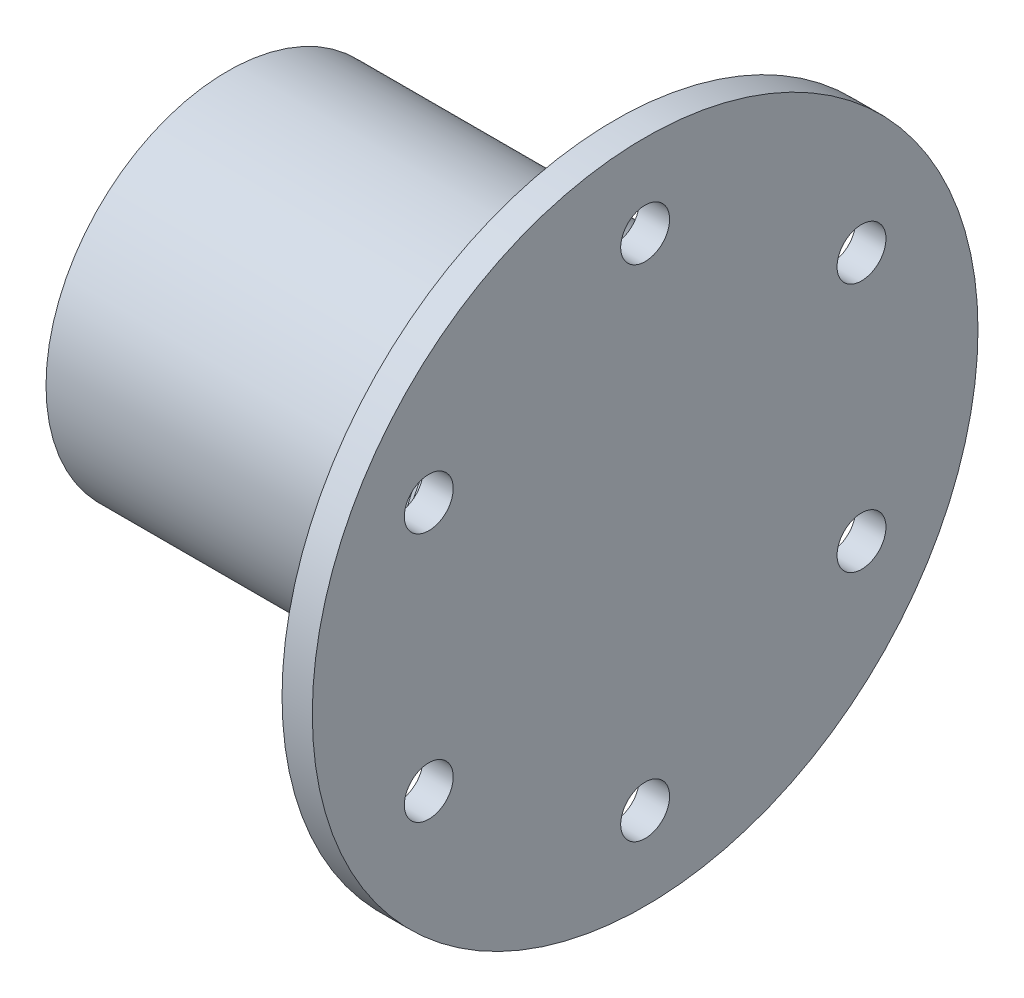
ISO-10303-21;
HEADER;
FILE_DESCRIPTION(('STEP AP214'),'2;1');
FILE_NAME('part.step','',(''),(''),'','','');
FILE_SCHEMA(('AUTOMOTIVE_DESIGN { 1 0 10303 214 1 1 1 1 }'));
ENDSEC;
DATA;
#1=APPLICATION_CONTEXT('core data for automotive mechanical design processes');
#2=APPLICATION_PROTOCOL_DEFINITION('international standard','automotive_design',2000,#1);
#3=PRODUCT_CONTEXT('',#1,'mechanical');
#4=PRODUCT('Part','Part','',(#3));
#5=PRODUCT_RELATED_PRODUCT_CATEGORY('part','',(#4));
#6=PRODUCT_DEFINITION_FORMATION('','',#4);
#7=PRODUCT_DEFINITION_CONTEXT('part definition',#1,'design');
#8=PRODUCT_DEFINITION('design','',#6,#7);
#9=PRODUCT_DEFINITION_SHAPE('','',#8);
#10=(LENGTH_UNIT() NAMED_UNIT(*) SI_UNIT(.MILLI.,.METRE.));
#11=(NAMED_UNIT(*) PLANE_ANGLE_UNIT() SI_UNIT($,.RADIAN.));
#12=(NAMED_UNIT(*) SI_UNIT($,.STERADIAN.) SOLID_ANGLE_UNIT());
#13=UNCERTAINTY_MEASURE_WITH_UNIT(LENGTH_MEASURE(1.E-05),#10,'distance_accuracy_value','');
#14=(GEOMETRIC_REPRESENTATION_CONTEXT(3) GLOBAL_UNCERTAINTY_ASSIGNED_CONTEXT((#13)) GLOBAL_UNIT_ASSIGNED_CONTEXT((#10,
#11,#12)) REPRESENTATION_CONTEXT('',''));
#15=CARTESIAN_POINT('',(0.,0.,0.));
#16=DIRECTION('',(0.,0.,1.));
#17=DIRECTION('',(1.,0.,0.));
#18=AXIS2_PLACEMENT_3D('',#15,#16,#17);
#19=CARTESIAN_POINT('',(2.5,0.,0.));
#20=DIRECTION('',(1.,0.,0.));
#21=DIRECTION('',(0.,0.,-1.));
#22=AXIS2_PLACEMENT_3D('',#19,#20,#21);
#23=PLANE('',#22);
#24=CARTESIAN_POINT('',(2.5,-10.3199999999998,17.8747643341109));
#25=DIRECTION('',(1.,0.,0.));
#26=DIRECTION('',(0.,0.,-1.));
#27=AXIS2_PLACEMENT_3D('',#24,#25,#26);
#28=CIRCLE('',#27,2.01929999999999);
#29=CARTESIAN_POINT('',(2.5,-10.3199999999998,15.8554643341109));
#30=VERTEX_POINT('',#29);
#31=EDGE_CURVE('E89',#30,#30,#28,.T.);
#32=ORIENTED_EDGE('',*,*,#31,.F.);
#33=EDGE_LOOP('',(#32));
#34=FACE_BOUND('',#33,.T.);
#35=CARTESIAN_POINT('',(2.5,-10.3200000000001,-17.8747643341108));
#36=DIRECTION('',(1.,0.,0.));
#37=DIRECTION('',(0.,0.,-1.));
#38=AXIS2_PLACEMENT_3D('',#35,#36,#37);
#39=CIRCLE('',#38,2.01929999999999);
#40=CARTESIAN_POINT('',(2.5,-10.3200000000001,-19.8940643341108));
#41=VERTEX_POINT('',#40);
#42=EDGE_CURVE('E77',#41,#41,#39,.T.);
#43=ORIENTED_EDGE('',*,*,#42,.F.);
#44=EDGE_LOOP('',(#43));
#45=FACE_BOUND('',#44,.T.);
#46=CARTESIAN_POINT('',(2.5,20.64,0.));
#47=DIRECTION('',(1.,0.,0.));
#48=DIRECTION('',(0.,0.,-1.));
#49=AXIS2_PLACEMENT_3D('',#46,#47,#48);
#50=CIRCLE('',#49,2.01929999999999);
#51=CARTESIAN_POINT('',(2.5,20.64,-2.01929999999999));
#52=VERTEX_POINT('',#51);
#53=EDGE_CURVE('E65',#52,#52,#50,.T.);
#54=ORIENTED_EDGE('',*,*,#53,.F.);
#55=EDGE_LOOP('',(#54));
#56=FACE_BOUND('',#55,.T.);
#57=CARTESIAN_POINT('',(2.5,0.,0.));
#58=DIRECTION('',(1.,0.,0.));
#59=DIRECTION('',(0.,0.,-1.));
#60=AXIS2_PLACEMENT_3D('',#57,#58,#59);
#61=CIRCLE('',#60,27.5);
#62=CARTESIAN_POINT('',(2.5,0.,-27.5));
#63=VERTEX_POINT('',#62);
#64=EDGE_CURVE('E59',#63,#63,#61,.T.);
#65=ORIENTED_EDGE('',*,*,#64,.T.);
#66=EDGE_LOOP('',(#65));
#67=FACE_BOUND('',#66,.T.);
#68=CARTESIAN_POINT('',(2.5,10.32,-17.8747643341108));
#69=DIRECTION('',(1.,0.,0.));
#70=DIRECTION('',(0.,0.,-1.));
#71=AXIS2_PLACEMENT_3D('',#68,#69,#70);
#72=CIRCLE('',#71,2.01929999999999);
#73=CARTESIAN_POINT('',(2.5,10.32,-19.8940643341108));
#74=VERTEX_POINT('',#73);
#75=EDGE_CURVE('E71',#74,#74,#72,.T.);
#76=ORIENTED_EDGE('',*,*,#75,.F.);
#77=EDGE_LOOP('',(#76));
#78=FACE_BOUND('',#77,.T.);
#79=CARTESIAN_POINT('',(2.5,-20.64,1.44128349667445E-13));
#80=DIRECTION('',(1.,0.,0.));
#81=DIRECTION('',(0.,0.,-1.));
#82=AXIS2_PLACEMENT_3D('',#79,#80,#81);
#83=CIRCLE('',#82,2.01929999999999);
#84=CARTESIAN_POINT('',(2.5,-20.64,-2.01929999999985));
#85=VERTEX_POINT('',#84);
#86=EDGE_CURVE('E83',#85,#85,#83,.T.);
#87=ORIENTED_EDGE('',*,*,#86,.F.);
#88=EDGE_LOOP('',(#87));
#89=FACE_BOUND('',#88,.T.);
#90=CARTESIAN_POINT('',(2.5,10.3200000000002,17.8747643341107));
#91=DIRECTION('',(1.,0.,0.));
#92=DIRECTION('',(0.,0.,-1.));
#93=AXIS2_PLACEMENT_3D('',#90,#91,#92);
#94=CIRCLE('',#93,2.01929999999999);
#95=CARTESIAN_POINT('',(2.5,10.3200000000002,15.8554643341107));
#96=VERTEX_POINT('',#95);
#97=EDGE_CURVE('E95',#96,#96,#94,.T.);
#98=ORIENTED_EDGE('',*,*,#97,.F.);
#99=EDGE_LOOP('',(#98));
#100=FACE_BOUND('',#99,.T.);
#101=ADVANCED_FACE('F43',(#34,#45,#56,#67,#78,#89,#100),#23,.T.);
#102=CARTESIAN_POINT('',(0.,0.,0.));
#103=DIRECTION('',(1.,0.,0.));
#104=DIRECTION('',(0.,0.,-1.));
#105=AXIS2_PLACEMENT_3D('',#102,#103,#104);
#106=PLANE('',#105);
#107=CARTESIAN_POINT('',(0.,0.,0.));
#108=DIRECTION('',(1.,0.,0.));
#109=DIRECTION('',(0.,0.,-1.));
#110=AXIS2_PLACEMENT_3D('',#107,#108,#109);
#111=CIRCLE('',#110,17.46);
#112=CARTESIAN_POINT('',(0.,0.,-17.46));
#113=VERTEX_POINT('',#112);
#114=EDGE_CURVE('E55',#113,#113,#111,.F.);
#115=ORIENTED_EDGE('',*,*,#114,.F.);
#116=EDGE_LOOP('',(#115));
#117=FACE_BOUND('',#116,.T.);
#118=CARTESIAN_POINT('',(0.,0.,0.));
#119=DIRECTION('',(1.,0.,0.));
#120=DIRECTION('',(0.,0.,-1.));
#121=AXIS2_PLACEMENT_3D('',#118,#119,#120);
#122=CIRCLE('',#121,27.5);
#123=CARTESIAN_POINT('',(0.,0.,-27.5));
#124=VERTEX_POINT('',#123);
#125=EDGE_CURVE('E62',#124,#124,#122,.T.);
#126=ORIENTED_EDGE('',*,*,#125,.F.);
#127=EDGE_LOOP('',(#126));
#128=FACE_BOUND('',#127,.T.);
#129=CARTESIAN_POINT('',(0.,20.64,0.));
#130=DIRECTION('',(1.,0.,0.));
#131=DIRECTION('',(0.,0.,-1.));
#132=AXIS2_PLACEMENT_3D('',#129,#130,#131);
#133=CIRCLE('',#132,2.01929999999999);
#134=CARTESIAN_POINT('',(0.,20.64,-2.01929999999999));
#135=VERTEX_POINT('',#134);
#136=EDGE_CURVE('E68',#135,#135,#133,.T.);
#137=ORIENTED_EDGE('',*,*,#136,.T.);
#138=EDGE_LOOP('',(#137));
#139=FACE_BOUND('',#138,.T.);
#140=CARTESIAN_POINT('',(0.,10.32,-17.8747643341108));
#141=DIRECTION('',(1.,0.,0.));
#142=DIRECTION('',(0.,0.,-1.));
#143=AXIS2_PLACEMENT_3D('',#140,#141,#142);
#144=CIRCLE('',#143,2.01929999999999);
#145=CARTESIAN_POINT('',(0.,10.32,-19.8940643341108));
#146=VERTEX_POINT('',#145);
#147=EDGE_CURVE('E74',#146,#146,#144,.T.);
#148=ORIENTED_EDGE('',*,*,#147,.T.);
#149=EDGE_LOOP('',(#148));
#150=FACE_BOUND('',#149,.T.);
#151=CARTESIAN_POINT('',(0.,-10.3200000000001,-17.8747643341108));
#152=DIRECTION('',(1.,0.,0.));
#153=DIRECTION('',(0.,0.,-1.));
#154=AXIS2_PLACEMENT_3D('',#151,#152,#153);
#155=CIRCLE('',#154,2.01929999999999);
#156=CARTESIAN_POINT('',(0.,-10.3200000000001,-19.8940643341108));
#157=VERTEX_POINT('',#156);
#158=EDGE_CURVE('E80',#157,#157,#155,.T.);
#159=ORIENTED_EDGE('',*,*,#158,.T.);
#160=EDGE_LOOP('',(#159));
#161=FACE_BOUND('',#160,.T.);
#162=CARTESIAN_POINT('',(0.,-20.64,1.44128349667445E-13));
#163=DIRECTION('',(1.,0.,0.));
#164=DIRECTION('',(0.,0.,-1.));
#165=AXIS2_PLACEMENT_3D('',#162,#163,#164);
#166=CIRCLE('',#165,2.01929999999999);
#167=CARTESIAN_POINT('',(0.,-20.64,-2.01929999999985));
#168=VERTEX_POINT('',#167);
#169=EDGE_CURVE('E86',#168,#168,#166,.T.);
#170=ORIENTED_EDGE('',*,*,#169,.T.);
#171=EDGE_LOOP('',(#170));
#172=FACE_BOUND('',#171,.T.);
#173=CARTESIAN_POINT('',(0.,-10.3199999999998,17.8747643341109));
#174=DIRECTION('',(1.,0.,0.));
#175=DIRECTION('',(0.,0.,-1.));
#176=AXIS2_PLACEMENT_3D('',#173,#174,#175);
#177=CIRCLE('',#176,2.01929999999999);
#178=CARTESIAN_POINT('',(0.,-10.3199999999998,15.8554643341109));
#179=VERTEX_POINT('',#178);
#180=EDGE_CURVE('E92',#179,#179,#177,.T.);
#181=ORIENTED_EDGE('',*,*,#180,.T.);
#182=EDGE_LOOP('',(#181));
#183=FACE_BOUND('',#182,.T.);
#184=CARTESIAN_POINT('',(0.,10.3200000000002,17.8747643341107));
#185=DIRECTION('',(1.,0.,0.));
#186=DIRECTION('',(0.,0.,-1.));
#187=AXIS2_PLACEMENT_3D('',#184,#185,#186);
#188=CIRCLE('',#187,2.01929999999999);
#189=CARTESIAN_POINT('',(0.,10.3200000000002,15.8554643341107));
#190=VERTEX_POINT('',#189);
#191=EDGE_CURVE('E98',#190,#190,#188,.T.);
#192=ORIENTED_EDGE('',*,*,#191,.T.);
#193=EDGE_LOOP('',(#192));
#194=FACE_BOUND('',#193,.T.);
#195=ADVANCED_FACE('F121',(#117,#128,#139,#150,#161,#172,#183,#194),#106,.F.);
#196=CARTESIAN_POINT('',(2.5,0.,0.));
#197=DIRECTION('',(-1.,0.,0.));
#198=DIRECTION('',(0.,0.,1.));
#199=AXIS2_PLACEMENT_3D('',#196,#197,#198);
#200=CYLINDRICAL_SURFACE('',#199,27.5);
#201=ORIENTED_EDGE('',*,*,#64,.F.);
#202=EDGE_LOOP('',(#201));
#203=FACE_BOUND('',#202,.T.);
#204=ORIENTED_EDGE('',*,*,#125,.T.);
#205=EDGE_LOOP('',(#204));
#206=FACE_BOUND('',#205,.T.);
#207=ADVANCED_FACE('F128',(#203,#206),#200,.T.);
#208=CARTESIAN_POINT('',(2.5,20.64,0.));
#209=DIRECTION('',(-1.,0.,0.));
#210=DIRECTION('',(0.,0.,1.));
#211=AXIS2_PLACEMENT_3D('',#208,#209,#210);
#212=CYLINDRICAL_SURFACE('',#211,2.01929999999999);
#213=ORIENTED_EDGE('',*,*,#53,.T.);
#214=EDGE_LOOP('',(#213));
#215=FACE_BOUND('',#214,.T.);
#216=ORIENTED_EDGE('',*,*,#136,.F.);
#217=EDGE_LOOP('',(#216));
#218=FACE_BOUND('',#217,.T.);
#219=ADVANCED_FACE('F134',(#215,#218),#212,.F.);
#220=CARTESIAN_POINT('',(2.5,10.32,-17.8747643341108));
#221=DIRECTION('',(-1.,0.,0.));
#222=DIRECTION('',(0.,0.,1.));
#223=AXIS2_PLACEMENT_3D('',#220,#221,#222);
#224=CYLINDRICAL_SURFACE('',#223,2.01929999999999);
#225=ORIENTED_EDGE('',*,*,#75,.T.);
#226=EDGE_LOOP('',(#225));
#227=FACE_BOUND('',#226,.T.);
#228=ORIENTED_EDGE('',*,*,#147,.F.);
#229=EDGE_LOOP('',(#228));
#230=FACE_BOUND('',#229,.T.);
#231=ADVANCED_FACE('F140',(#227,#230),#224,.F.);
#232=CARTESIAN_POINT('',(2.5,-10.3200000000001,-17.8747643341108));
#233=DIRECTION('',(-1.,0.,0.));
#234=DIRECTION('',(0.,0.,1.));
#235=AXIS2_PLACEMENT_3D('',#232,#233,#234);
#236=CYLINDRICAL_SURFACE('',#235,2.01929999999999);
#237=ORIENTED_EDGE('',*,*,#42,.T.);
#238=EDGE_LOOP('',(#237));
#239=FACE_BOUND('',#238,.T.);
#240=ORIENTED_EDGE('',*,*,#158,.F.);
#241=EDGE_LOOP('',(#240));
#242=FACE_BOUND('',#241,.T.);
#243=ADVANCED_FACE('F178',(#239,#242),#236,.F.);
#244=CARTESIAN_POINT('',(2.5,-20.64,1.44128349667445E-13));
#245=DIRECTION('',(-1.,0.,0.));
#246=DIRECTION('',(0.,0.,1.));
#247=AXIS2_PLACEMENT_3D('',#244,#245,#246);
#248=CYLINDRICAL_SURFACE('',#247,2.01929999999999);
#249=ORIENTED_EDGE('',*,*,#86,.T.);
#250=EDGE_LOOP('',(#249));
#251=FACE_BOUND('',#250,.T.);
#252=ORIENTED_EDGE('',*,*,#169,.F.);
#253=EDGE_LOOP('',(#252));
#254=FACE_BOUND('',#253,.T.);
#255=ADVANCED_FACE('F171',(#251,#254),#248,.F.);
#256=CARTESIAN_POINT('',(2.5,-10.3199999999998,17.8747643341109));
#257=DIRECTION('',(-1.,0.,0.));
#258=DIRECTION('',(0.,0.,1.));
#259=AXIS2_PLACEMENT_3D('',#256,#257,#258);
#260=CYLINDRICAL_SURFACE('',#259,2.01929999999999);
#261=ORIENTED_EDGE('',*,*,#31,.T.);
#262=EDGE_LOOP('',(#261));
#263=FACE_BOUND('',#262,.T.);
#264=ORIENTED_EDGE('',*,*,#180,.F.);
#265=EDGE_LOOP('',(#264));
#266=FACE_BOUND('',#265,.T.);
#267=ADVANCED_FACE('F162',(#263,#266),#260,.F.);
#268=CARTESIAN_POINT('',(2.5,10.3200000000002,17.8747643341107));
#269=DIRECTION('',(-1.,0.,0.));
#270=DIRECTION('',(0.,0.,1.));
#271=AXIS2_PLACEMENT_3D('',#268,#269,#270);
#272=CYLINDRICAL_SURFACE('',#271,2.01929999999999);
#273=ORIENTED_EDGE('',*,*,#97,.T.);
#274=EDGE_LOOP('',(#273));
#275=FACE_BOUND('',#274,.T.);
#276=ORIENTED_EDGE('',*,*,#191,.F.);
#277=EDGE_LOOP('',(#276));
#278=FACE_BOUND('',#277,.T.);
#279=ADVANCED_FACE('F159',(#275,#278),#272,.F.);
#280=CARTESIAN_POINT('',(-2.,0.,0.));
#281=DIRECTION('',(1.,0.,0.));
#282=DIRECTION('',(0.,0.,-1.));
#283=AXIS2_PLACEMENT_3D('',#280,#281,#282);
#284=CYLINDRICAL_SURFACE('',#283,17.46);
#285=CARTESIAN_POINT('',(-1.00000000000001,0.,0.));
#286=DIRECTION('',(-1.,0.,0.));
#287=DIRECTION('',(0.,0.,1.));
#288=AXIS2_PLACEMENT_3D('',#285,#286,#287);
#289=CIRCLE('',#288,17.46);
#290=CARTESIAN_POINT('',(-1.00000000000001,0.,17.46));
#291=VERTEX_POINT('',#290);
#292=EDGE_CURVE('E10',#291,#291,#289,.F.);
#293=ORIENTED_EDGE('',*,*,#292,.T.);
#294=EDGE_LOOP('',(#293));
#295=FACE_BOUND('',#294,.T.);
#296=ORIENTED_EDGE('',*,*,#114,.T.);
#297=EDGE_LOOP('',(#296));
#298=FACE_BOUND('',#297,.T.);
#299=ADVANCED_FACE('F161',(#295,#298),#284,.T.);
#300=CARTESIAN_POINT('',(-2.,0.,0.));
#301=DIRECTION('',(-1.,0.,0.));
#302=DIRECTION('',(0.,0.,1.));
#303=AXIS2_PLACEMENT_3D('',#300,#301,#302);
#304=PLANE('',#303);
#305=CARTESIAN_POINT('',(-2.,0.,0.));
#306=DIRECTION('',(1.,0.,0.));
#307=DIRECTION('',(0.,0.,-1.));
#308=AXIS2_PLACEMENT_3D('',#305,#306,#307);
#309=CIRCLE('',#308,15.);
#310=CARTESIAN_POINT('',(-2.,0.,-15.));
#311=VERTEX_POINT('',#310);
#312=EDGE_CURVE('E104',#311,#311,#309,.T.);
#313=ORIENTED_EDGE('',*,*,#312,.T.);
#314=EDGE_LOOP('',(#313));
#315=FACE_BOUND('',#314,.T.);
#316=CARTESIAN_POINT('',(-2.,0.,0.));
#317=DIRECTION('',(-1.,0.,0.));
#318=DIRECTION('',(0.,0.,1.));
#319=AXIS2_PLACEMENT_3D('',#316,#317,#318);
#320=CIRCLE('',#319,16.46);
#321=CARTESIAN_POINT('',(-2.,0.,16.46));
#322=VERTEX_POINT('',#321);
#323=EDGE_CURVE('E51',#322,#322,#320,.T.);
#324=ORIENTED_EDGE('',*,*,#323,.T.);
#325=EDGE_LOOP('',(#324));
#326=FACE_BOUND('',#325,.T.);
#327=ADVANCED_FACE('F169',(#315,#326),#304,.T.);
#328=CARTESIAN_POINT('',(-2.,0.,0.));
#329=DIRECTION('',(1.,0.,0.));
#330=DIRECTION('',(0.,0.,-1.));
#331=AXIS2_PLACEMENT_3D('',#328,#329,#330);
#332=CONICAL_SURFACE('',#331,16.46,0.785398163397447);
#333=ORIENTED_EDGE('',*,*,#292,.F.);
#334=EDGE_LOOP('',(#333));
#335=FACE_BOUND('',#334,.T.);
#336=ORIENTED_EDGE('',*,*,#323,.F.);
#337=EDGE_LOOP('',(#336));
#338=FACE_BOUND('',#337,.T.);
#339=ADVANCED_FACE('F46',(#335,#338),#332,.T.);
#340=CARTESIAN_POINT('',(-32.,0.,0.));
#341=DIRECTION('',(1.,0.,0.));
#342=DIRECTION('',(0.,0.,-1.));
#343=AXIS2_PLACEMENT_3D('',#340,#341,#342);
#344=CYLINDRICAL_SURFACE('',#343,15.);
#345=CARTESIAN_POINT('',(-32.,0.,0.));
#346=DIRECTION('',(1.,0.,0.));
#347=DIRECTION('',(0.,0.,-1.));
#348=AXIS2_PLACEMENT_3D('',#345,#346,#347);
#349=CIRCLE('',#348,15.);
#350=CARTESIAN_POINT('',(-32.,0.,-15.));
#351=VERTEX_POINT('',#350);
#352=EDGE_CURVE('E101',#351,#351,#349,.T.);
#353=ORIENTED_EDGE('',*,*,#352,.T.);
#354=EDGE_LOOP('',(#353));
#355=FACE_BOUND('',#354,.T.);
#356=ORIENTED_EDGE('',*,*,#312,.F.);
#357=EDGE_LOOP('',(#356));
#358=FACE_BOUND('',#357,.T.);
#359=ADVANCED_FACE('F110',(#355,#358),#344,.T.);
#360=CARTESIAN_POINT('',(-32.,0.,0.));
#361=DIRECTION('',(1.,0.,0.));
#362=DIRECTION('',(0.,0.,-1.));
#363=AXIS2_PLACEMENT_3D('',#360,#361,#362);
#364=PLANE('',#363);
#365=ORIENTED_EDGE('',*,*,#352,.F.);
#366=EDGE_LOOP('',(#365));
#367=FACE_BOUND('',#366,.T.);
#368=ADVANCED_FACE('F113',(#367),#364,.F.);
#369=CLOSED_SHELL('',(#101,#195,#207,#219,#231,#243,#255,#267,#279,#299,#327,#339,#359,#368));
#370=MANIFOLD_SOLID_BREP('B2',#369);
#371=ADVANCED_BREP_SHAPE_REPRESENTATION('',(#18,#370),#14);
#372=SHAPE_DEFINITION_REPRESENTATION(#9,#371);
ENDSEC;
END-ISO-10303-21;
